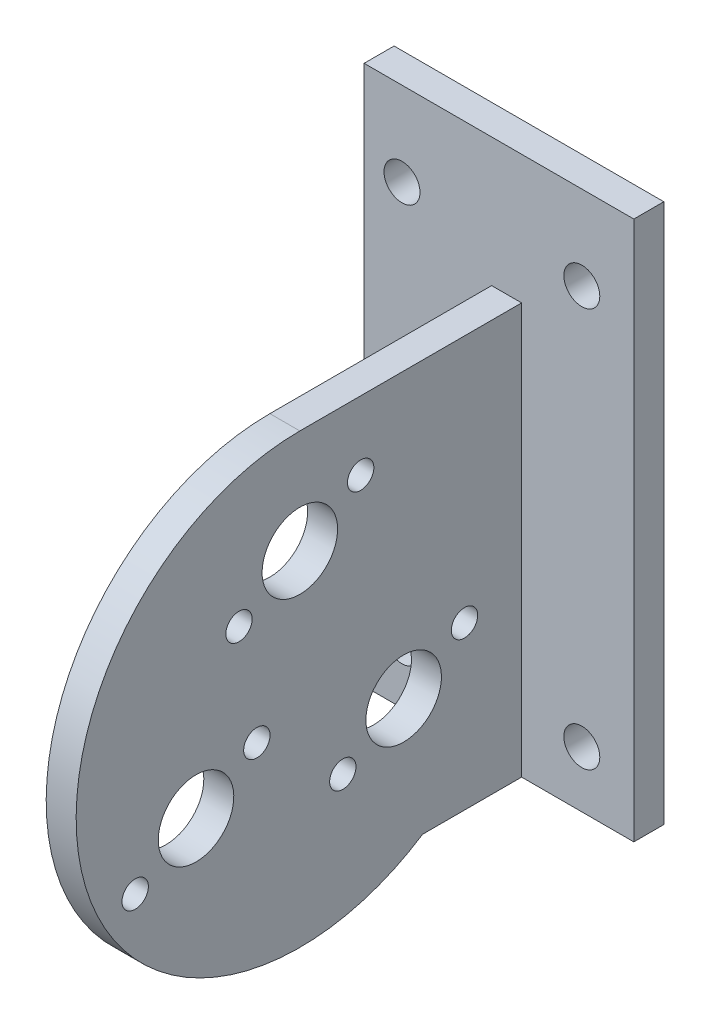
ISO-10303-21;
HEADER;
FILE_DESCRIPTION(('STEP AP214'),'2;1');
FILE_NAME('part.step','',(''),(''),'','','');
FILE_SCHEMA(('AUTOMOTIVE_DESIGN { 1 0 10303 214 1 1 1 1 }'));
ENDSEC;
DATA;
#1=APPLICATION_CONTEXT('core data for automotive mechanical design processes');
#2=APPLICATION_PROTOCOL_DEFINITION('international standard','automotive_design',2000,#1);
#3=PRODUCT_CONTEXT('',#1,'mechanical');
#4=PRODUCT('Part','Part','',(#3));
#5=PRODUCT_RELATED_PRODUCT_CATEGORY('part','',(#4));
#6=PRODUCT_DEFINITION_FORMATION('','',#4);
#7=PRODUCT_DEFINITION_CONTEXT('part definition',#1,'design');
#8=PRODUCT_DEFINITION('design','',#6,#7);
#9=PRODUCT_DEFINITION_SHAPE('','',#8);
#10=(LENGTH_UNIT() NAMED_UNIT(*) SI_UNIT(.MILLI.,.METRE.));
#11=(NAMED_UNIT(*) PLANE_ANGLE_UNIT() SI_UNIT($,.RADIAN.));
#12=(NAMED_UNIT(*) SI_UNIT($,.STERADIAN.) SOLID_ANGLE_UNIT());
#13=UNCERTAINTY_MEASURE_WITH_UNIT(LENGTH_MEASURE(1.E-05),#10,'distance_accuracy_value','');
#14=(GEOMETRIC_REPRESENTATION_CONTEXT(3) GLOBAL_UNCERTAINTY_ASSIGNED_CONTEXT((#13)) GLOBAL_UNIT_ASSIGNED_CONTEXT((#10,
#11,#12)) REPRESENTATION_CONTEXT('',''));
#15=CARTESIAN_POINT('',(0.,0.,0.));
#16=DIRECTION('',(0.,0.,1.));
#17=DIRECTION('',(1.,0.,0.));
#18=AXIS2_PLACEMENT_3D('',#15,#16,#17);
#19=CARTESIAN_POINT('',(265.322812887282,1.09054952266361,-22.2293772062087));
#20=DIRECTION('',(1.,0.,0.));
#21=DIRECTION('',(0.,1.,0.));
#22=AXIS2_PLACEMENT_3D('',#19,#20,#21);
#23=CYLINDRICAL_SURFACE('',#22,23.6982);
#24=DIRECTION('',(1.,0.,0.));
#25=VECTOR('',#24,1.);
#26=CARTESIAN_POINT('',(265.322812887282,24.7887495226637,-22.2293772062087));
#27=LINE('',#26,#25);
#28=CARTESIAN_POINT('',(265.322812887282,24.7887495226637,-22.2293772062087));
#29=VERTEX_POINT('',#28);
#30=CARTESIAN_POINT('',(268.497812887282,24.7887495226637,-22.2293772062087));
#31=VERTEX_POINT('',#30);
#32=EDGE_CURVE('E121',#29,#31,#27,.T.);
#33=ORIENTED_EDGE('',*,*,#32,.F.);
#34=CARTESIAN_POINT('',(265.322812887282,1.09054952266361,-22.2293772062087));
#35=DIRECTION('',(-1.,0.,0.));
#36=DIRECTION('',(0.,-1.,0.));
#37=AXIS2_PLACEMENT_3D('',#34,#35,#36);
#38=CIRCLE('',#37,23.6982);
#39=CARTESIAN_POINT('',(265.322812887282,-18.7214504773365,-35.2328128768305));
#40=VERTEX_POINT('',#39);
#41=EDGE_CURVE('E11',#40,#29,#38,.T.);
#42=ORIENTED_EDGE('',*,*,#41,.F.);
#43=DIRECTION('',(1.,0.,0.));
#44=VECTOR('',#43,1.);
#45=CARTESIAN_POINT('',(265.322812887282,-18.7214504773365,-35.2328128768305));
#46=LINE('',#45,#44);
#47=CARTESIAN_POINT('',(268.497812887282,-18.7214504773365,-35.2328128768305));
#48=VERTEX_POINT('',#47);
#49=EDGE_CURVE('E124',#40,#48,#46,.T.);
#50=ORIENTED_EDGE('',*,*,#49,.T.);
#51=CARTESIAN_POINT('',(268.497812887282,1.09054952266361,-22.2293772062087));
#52=DIRECTION('',(-1.,0.,0.));
#53=DIRECTION('',(0.,-1.,0.));
#54=AXIS2_PLACEMENT_3D('',#51,#52,#53);
#55=CIRCLE('',#54,23.6982);
#56=EDGE_CURVE('E38',#48,#31,#55,.T.);
#57=ORIENTED_EDGE('',*,*,#56,.T.);
#58=EDGE_LOOP('',(#33,#42,#50,#57));
#59=FACE_BOUND('',#58,.T.);
#60=ADVANCED_FACE('F35',(#59),#23,.T.);
#61=CARTESIAN_POINT('',(0.,0.,-45.7243772062088));
#62=DIRECTION('',(0.,0.,1.));
#63=DIRECTION('',(1.,0.,0.));
#64=AXIS2_PLACEMENT_3D('',#61,#62,#63);
#65=PLANE('',#64);
#66=CARTESIAN_POINT('',(255.82566690415,-12.7524504773365,-45.7243772062088));
#67=DIRECTION('',(0.,0.,1.));
#68=DIRECTION('',(1.,0.,0.));
#69=AXIS2_PLACEMENT_3D('',#66,#67,#68);
#70=CIRCLE('',#69,1.90499999999999);
#71=CARTESIAN_POINT('',(257.73066690415,-12.7524504773365,-45.7243772062088));
#72=VERTEX_POINT('',#71);
#73=EDGE_CURVE('E262',#72,#72,#70,.T.);
#74=ORIENTED_EDGE('',*,*,#73,.F.);
#75=EDGE_LOOP('',(#74));
#76=FACE_BOUND('',#75,.T.);
#77=CARTESIAN_POINT('',(255.82566690415,29.5385495226635,-45.7243772062088));
#78=DIRECTION('',(0.,0.,1.));
#79=DIRECTION('',(1.,0.,0.));
#80=AXIS2_PLACEMENT_3D('',#77,#78,#79);
#81=CIRCLE('',#80,1.90499999999999);
#82=CARTESIAN_POINT('',(257.73066690415,29.5385495226635,-45.7243772062088));
#83=VERTEX_POINT('',#82);
#84=EDGE_CURVE('E256',#83,#83,#81,.T.);
#85=ORIENTED_EDGE('',*,*,#84,.F.);
#86=EDGE_LOOP('',(#85));
#87=FACE_BOUND('',#86,.T.);
#88=CARTESIAN_POINT('',(274.87566690415,29.5385495226635,-45.7243772062088));
#89=DIRECTION('',(0.,0.,1.));
#90=DIRECTION('',(1.,0.,0.));
#91=AXIS2_PLACEMENT_3D('',#88,#89,#90);
#92=CIRCLE('',#91,1.90499999999999);
#93=CARTESIAN_POINT('',(276.78066690415,29.5385495226635,-45.7243772062088));
#94=VERTEX_POINT('',#93);
#95=EDGE_CURVE('E250',#94,#94,#92,.T.);
#96=ORIENTED_EDGE('',*,*,#95,.F.);
#97=EDGE_LOOP('',(#96));
#98=FACE_BOUND('',#97,.T.);
#99=CARTESIAN_POINT('',(274.87566690415,-12.7524504773365,-45.7243772062088));
#100=DIRECTION('',(0.,0.,1.));
#101=DIRECTION('',(1.,0.,0.));
#102=AXIS2_PLACEMENT_3D('',#99,#100,#101);
#103=CIRCLE('',#102,1.90499999999999);
#104=CARTESIAN_POINT('',(276.78066690415,-12.7524504773365,-45.7243772062088));
#105=VERTEX_POINT('',#104);
#106=EDGE_CURVE('E242',#105,#105,#103,.T.);
#107=ORIENTED_EDGE('',*,*,#106,.F.);
#108=EDGE_LOOP('',(#107));
#109=FACE_BOUND('',#108,.T.);
#110=DIRECTION('',(0.,1.,0.));
#111=VECTOR('',#110,1.);
#112=CARTESIAN_POINT('',(265.322812887282,1.09054952266361,-45.7243772062088));
#113=LINE('',#112,#111);
#114=CARTESIAN_POINT('',(265.322812887282,-18.7214504773365,-45.7243772062088));
#115=VERTEX_POINT('',#114);
#116=CARTESIAN_POINT('',(265.322812887282,24.7887495226637,-45.7243772062088));
#117=VERTEX_POINT('',#116);
#118=EDGE_CURVE('E49',#115,#117,#113,.T.);
#119=ORIENTED_EDGE('',*,*,#118,.T.);
#120=DIRECTION('',(1.,0.,0.));
#121=VECTOR('',#120,1.);
#122=CARTESIAN_POINT('',(265.322812887282,24.7887495226637,-45.7243772062088));
#123=LINE('',#122,#121);
#124=CARTESIAN_POINT('',(268.497812887282,24.7887495226637,-45.7243772062088));
#125=VERTEX_POINT('',#124);
#126=EDGE_CURVE('E102',#117,#125,#123,.T.);
#127=ORIENTED_EDGE('',*,*,#126,.T.);
#128=DIRECTION('',(0.,1.,0.));
#129=VECTOR('',#128,1.);
#130=CARTESIAN_POINT('',(268.497812887282,1.09054952266361,-45.7243772062088));
#131=LINE('',#130,#129);
#132=CARTESIAN_POINT('',(268.497812887282,-18.7214504773365,-45.7243772062088));
#133=VERTEX_POINT('',#132);
#134=EDGE_CURVE('E57',#133,#125,#131,.T.);
#135=ORIENTED_EDGE('',*,*,#134,.F.);
#136=DIRECTION('',(1.,0.,0.));
#137=VECTOR('',#136,1.);
#138=CARTESIAN_POINT('',(280.387812887282,-18.7214504773365,-45.7243772062088));
#139=LINE('',#138,#137);
#140=CARTESIAN_POINT('',(280.387812887282,-18.7214504773365,-45.7243772062088));
#141=VERTEX_POINT('',#140);
#142=EDGE_CURVE('E100',#133,#141,#139,.T.);
#143=ORIENTED_EDGE('',*,*,#142,.T.);
#144=DIRECTION('',(0.,1.,0.));
#145=VECTOR('',#144,1.);
#146=CARTESIAN_POINT('',(280.387812887282,-18.7214504773365,-45.7243772062088));
#147=LINE('',#146,#145);
#148=CARTESIAN_POINT('',(280.387812887282,38.4285495226635,-45.7243772062088));
#149=VERTEX_POINT('',#148);
#150=EDGE_CURVE('E132',#141,#149,#147,.T.);
#151=ORIENTED_EDGE('',*,*,#150,.T.);
#152=DIRECTION('',(-1.,0.,0.));
#153=VECTOR('',#152,1.);
#154=CARTESIAN_POINT('',(280.387812887282,38.4285495226635,-45.7243772062088));
#155=LINE('',#154,#153);
#156=CARTESIAN_POINT('',(251.812812887282,38.4285495226635,-45.7243772062088));
#157=VERTEX_POINT('',#156);
#158=EDGE_CURVE('E134',#149,#157,#155,.T.);
#159=ORIENTED_EDGE('',*,*,#158,.T.);
#160=DIRECTION('',(0.,-1.,0.));
#161=VECTOR('',#160,1.);
#162=CARTESIAN_POINT('',(251.812812887282,-18.7214504773365,-45.7243772062088));
#163=LINE('',#162,#161);
#164=CARTESIAN_POINT('',(251.812812887282,-18.7214504773365,-45.7243772062088));
#165=VERTEX_POINT('',#164);
#166=EDGE_CURVE('E115',#157,#165,#163,.T.);
#167=ORIENTED_EDGE('',*,*,#166,.T.);
#168=EDGE_CURVE('E114',#165,#115,#139,.T.);
#169=ORIENTED_EDGE('',*,*,#168,.T.);
#170=EDGE_LOOP('',(#119,#127,#135,#143,#151,#159,#167,#169));
#171=FACE_BOUND('',#170,.T.);
#172=ADVANCED_FACE('F98',(#76,#87,#98,#109,#171),#65,.T.);
#173=CARTESIAN_POINT('',(265.322812887282,1.09054952266361,-22.2293772062087));
#174=DIRECTION('',(-1.,0.,0.));
#175=DIRECTION('',(0.,-1.,0.));
#176=AXIS2_PLACEMENT_3D('',#173,#174,#175);
#177=PLANE('',#176);
#178=ORIENTED_EDGE('',*,*,#118,.F.);
#179=DIRECTION('',(0.,0.,1.));
#180=VECTOR('',#179,1.);
#181=CARTESIAN_POINT('',(265.322812887282,-18.7214504773365,0.));
#182=LINE('',#181,#180);
#183=EDGE_CURVE('E120',#115,#40,#182,.T.);
#184=ORIENTED_EDGE('',*,*,#183,.T.);
#185=ORIENTED_EDGE('',*,*,#41,.T.);
#186=DIRECTION('',(0.,0.,1.));
#187=VECTOR('',#186,1.);
#188=CARTESIAN_POINT('',(265.322812887282,24.7887495226636,0.));
#189=LINE('',#188,#187);
#190=EDGE_CURVE('E237',#117,#29,#189,.T.);
#191=ORIENTED_EDGE('',*,*,#190,.F.);
#192=EDGE_LOOP('',(#178,#184,#185,#191));
#193=FACE_BOUND('',#192,.T.);
#194=CARTESIAN_POINT('',(265.322812887282,-5.25945047733652,-33.2278998342711));
#195=DIRECTION('',(-1.,0.,0.));
#196=DIRECTION('',(0.,-1.,0.));
#197=AXIS2_PLACEMENT_3D('',#194,#195,#196);
#198=CIRCLE('',#197,4.0005);
#199=CARTESIAN_POINT('',(265.322812887282,-9.25995047733652,-33.2278998342711));
#200=VERTEX_POINT('',#199);
#201=EDGE_CURVE('E162',#200,#200,#198,.T.);
#202=ORIENTED_EDGE('',*,*,#201,.F.);
#203=EDGE_LOOP('',(#202));
#204=FACE_BOUND('',#203,.T.);
#205=CARTESIAN_POINT('',(265.322812887282,10.0694495226637,-15.7842429461641));
#206=DIRECTION('',(-1.,0.,0.));
#207=DIRECTION('',(0.,-1.,0.));
#208=AXIS2_PLACEMENT_3D('',#205,#206,#207);
#209=CIRCLE('',#208,1.397);
#210=CARTESIAN_POINT('',(265.322812887282,8.67244952266366,-15.7842429461641));
#211=VERTEX_POINT('',#210);
#212=EDGE_CURVE('E174',#211,#211,#209,.T.);
#213=ORIENTED_EDGE('',*,*,#212,.F.);
#214=EDGE_LOOP('',(#213));
#215=FACE_BOUND('',#214,.T.);
#216=CARTESIAN_POINT('',(265.322812887282,-1.53835047733667,-39.6730340943157));
#217=DIRECTION('',(-1.,0.,0.));
#218=DIRECTION('',(0.,-1.,0.));
#219=AXIS2_PLACEMENT_3D('',#216,#217,#218);
#220=CIRCLE('',#219,1.39700000000001);
#221=CARTESIAN_POINT('',(265.322812887282,-2.93535047733668,-39.6730340943157));
#222=VERTEX_POINT('',#221);
#223=EDGE_CURVE('E186',#222,#222,#220,.T.);
#224=ORIENTED_EDGE('',*,*,#223,.F.);
#225=EDGE_LOOP('',(#224));
#226=FACE_BOUND('',#225,.T.);
#227=CARTESIAN_POINT('',(265.322812887282,-1.53835047733652,-17.6759888381909));
#228=DIRECTION('',(-1.,0.,0.));
#229=DIRECTION('',(0.,-1.,0.));
#230=AXIS2_PLACEMENT_3D('',#227,#228,#229);
#231=CIRCLE('',#230,1.397);
#232=CARTESIAN_POINT('',(265.322812887282,-2.93535047733652,-17.6759888381909));
#233=VERTEX_POINT('',#232);
#234=EDGE_CURVE('E198',#233,#233,#231,.T.);
#235=ORIENTED_EDGE('',*,*,#234,.F.);
#236=EDGE_LOOP('',(#235));
#237=FACE_BOUND('',#236,.T.);
#238=CARTESIAN_POINT('',(265.322812887282,-8.98055047733622,-4.78572031810167));
#239=DIRECTION('',(-1.,0.,0.));
#240=DIRECTION('',(0.,-1.,0.));
#241=AXIS2_PLACEMENT_3D('',#238,#239,#240);
#242=CIRCLE('',#241,1.397);
#243=CARTESIAN_POINT('',(265.322812887282,-10.3775504773362,-4.78572031810167));
#244=VERTEX_POINT('',#243);
#245=EDGE_CURVE('E204',#244,#244,#242,.T.);
#246=ORIENTED_EDGE('',*,*,#245,.F.);
#247=EDGE_LOOP('',(#246));
#248=FACE_BOUND('',#247,.T.);
#249=CARTESIAN_POINT('',(265.322812887282,-8.98055047733638,-26.7827655742264));
#250=DIRECTION('',(-1.,0.,0.));
#251=DIRECTION('',(0.,-1.,0.));
#252=AXIS2_PLACEMENT_3D('',#249,#250,#251);
#253=CIRCLE('',#252,1.397);
#254=CARTESIAN_POINT('',(265.322812887282,-10.3775504773364,-26.7827655742264));
#255=VERTEX_POINT('',#254);
#256=EDGE_CURVE('E192',#255,#255,#253,.T.);
#257=ORIENTED_EDGE('',*,*,#256,.F.);
#258=EDGE_LOOP('',(#257));
#259=FACE_BOUND('',#258,.T.);
#260=CARTESIAN_POINT('',(265.322812887282,17.5116495226634,-28.6745114662534));
#261=DIRECTION('',(-1.,0.,0.));
#262=DIRECTION('',(0.,-1.,0.));
#263=AXIS2_PLACEMENT_3D('',#260,#261,#262);
#264=CIRCLE('',#263,1.397);
#265=CARTESIAN_POINT('',(265.322812887282,16.1146495226634,-28.6745114662534));
#266=VERTEX_POINT('',#265);
#267=EDGE_CURVE('E180',#266,#266,#264,.T.);
#268=ORIENTED_EDGE('',*,*,#267,.F.);
#269=EDGE_LOOP('',(#268));
#270=FACE_BOUND('',#269,.T.);
#271=CARTESIAN_POINT('',(265.322812887282,-5.25945047733637,-11.2308545781463));
#272=DIRECTION('',(-1.,0.,0.));
#273=DIRECTION('',(0.,-1.,0.));
#274=AXIS2_PLACEMENT_3D('',#271,#272,#273);
#275=CIRCLE('',#274,4.0005);
#276=CARTESIAN_POINT('',(265.322812887282,-9.25995047733636,-11.2308545781463));
#277=VERTEX_POINT('',#276);
#278=EDGE_CURVE('E168',#277,#277,#275,.T.);
#279=ORIENTED_EDGE('',*,*,#278,.F.);
#280=EDGE_LOOP('',(#279));
#281=FACE_BOUND('',#280,.T.);
#282=CARTESIAN_POINT('',(265.322812887282,13.7905495226637,-22.2293772062087));
#283=DIRECTION('',(-1.,0.,0.));
#284=DIRECTION('',(0.,-1.,0.));
#285=AXIS2_PLACEMENT_3D('',#282,#283,#284);
#286=CIRCLE('',#285,4.0005);
#287=CARTESIAN_POINT('',(265.322812887282,9.79004952266365,-22.2293772062087));
#288=VERTEX_POINT('',#287);
#289=EDGE_CURVE('E156',#288,#288,#286,.T.);
#290=ORIENTED_EDGE('',*,*,#289,.F.);
#291=EDGE_LOOP('',(#290));
#292=FACE_BOUND('',#291,.T.);
#293=ADVANCED_FACE('F223',(#193,#204,#215,#226,#237,#248,#259,#270,#281,#292),#177,.T.);
#294=CARTESIAN_POINT('',(268.497812887282,1.09054952266361,-22.2293772062087));
#295=DIRECTION('',(-1.,0.,0.));
#296=DIRECTION('',(0.,-1.,0.));
#297=AXIS2_PLACEMENT_3D('',#294,#295,#296);
#298=PLANE('',#297);
#299=ORIENTED_EDGE('',*,*,#56,.F.);
#300=DIRECTION('',(0.,0.,1.));
#301=VECTOR('',#300,1.);
#302=CARTESIAN_POINT('',(268.497812887282,-18.7214504773365,0.));
#303=LINE('',#302,#301);
#304=EDGE_CURVE('E110',#133,#48,#303,.T.);
#305=ORIENTED_EDGE('',*,*,#304,.F.);
#306=ORIENTED_EDGE('',*,*,#134,.T.);
#307=DIRECTION('',(0.,0.,1.));
#308=VECTOR('',#307,1.);
#309=CARTESIAN_POINT('',(268.497812887282,24.7887495226636,0.));
#310=LINE('',#309,#308);
#311=EDGE_CURVE('E240',#125,#31,#310,.T.);
#312=ORIENTED_EDGE('',*,*,#311,.T.);
#313=EDGE_LOOP('',(#299,#305,#306,#312));
#314=FACE_BOUND('',#313,.T.);
#315=CARTESIAN_POINT('',(268.497812887282,-8.98055047733622,-4.78572031810167));
#316=DIRECTION('',(-1.,0.,0.));
#317=DIRECTION('',(0.,-1.,0.));
#318=AXIS2_PLACEMENT_3D('',#315,#316,#317);
#319=CIRCLE('',#318,1.397);
#320=CARTESIAN_POINT('',(268.497812887282,-10.3775504773362,-4.78572031810167));
#321=VERTEX_POINT('',#320);
#322=EDGE_CURVE('E201',#321,#321,#319,.T.);
#323=ORIENTED_EDGE('',*,*,#322,.T.);
#324=EDGE_LOOP('',(#323));
#325=FACE_BOUND('',#324,.T.);
#326=CARTESIAN_POINT('',(268.497812887282,-1.53835047733652,-17.6759888381909));
#327=DIRECTION('',(-1.,0.,0.));
#328=DIRECTION('',(0.,-1.,0.));
#329=AXIS2_PLACEMENT_3D('',#326,#327,#328);
#330=CIRCLE('',#329,1.397);
#331=CARTESIAN_POINT('',(268.497812887282,-2.93535047733652,-17.6759888381909));
#332=VERTEX_POINT('',#331);
#333=EDGE_CURVE('E195',#332,#332,#330,.T.);
#334=ORIENTED_EDGE('',*,*,#333,.T.);
#335=EDGE_LOOP('',(#334));
#336=FACE_BOUND('',#335,.T.);
#337=CARTESIAN_POINT('',(268.497812887282,-8.98055047733638,-26.7827655742264));
#338=DIRECTION('',(-1.,0.,0.));
#339=DIRECTION('',(0.,-1.,0.));
#340=AXIS2_PLACEMENT_3D('',#337,#338,#339);
#341=CIRCLE('',#340,1.397);
#342=CARTESIAN_POINT('',(268.497812887282,-10.3775504773364,-26.7827655742264));
#343=VERTEX_POINT('',#342);
#344=EDGE_CURVE('E189',#343,#343,#341,.T.);
#345=ORIENTED_EDGE('',*,*,#344,.T.);
#346=EDGE_LOOP('',(#345));
#347=FACE_BOUND('',#346,.T.);
#348=CARTESIAN_POINT('',(268.497812887282,-1.53835047733667,-39.6730340943157));
#349=DIRECTION('',(-1.,0.,0.));
#350=DIRECTION('',(0.,-1.,0.));
#351=AXIS2_PLACEMENT_3D('',#348,#349,#350);
#352=CIRCLE('',#351,1.39700000000001);
#353=CARTESIAN_POINT('',(268.497812887282,-2.93535047733668,-39.6730340943157));
#354=VERTEX_POINT('',#353);
#355=EDGE_CURVE('E183',#354,#354,#352,.T.);
#356=ORIENTED_EDGE('',*,*,#355,.T.);
#357=EDGE_LOOP('',(#356));
#358=FACE_BOUND('',#357,.T.);
#359=CARTESIAN_POINT('',(268.497812887282,17.5116495226634,-28.6745114662534));
#360=DIRECTION('',(-1.,0.,0.));
#361=DIRECTION('',(0.,-1.,0.));
#362=AXIS2_PLACEMENT_3D('',#359,#360,#361);
#363=CIRCLE('',#362,1.397);
#364=CARTESIAN_POINT('',(268.497812887282,16.1146495226634,-28.6745114662534));
#365=VERTEX_POINT('',#364);
#366=EDGE_CURVE('E177',#365,#365,#363,.T.);
#367=ORIENTED_EDGE('',*,*,#366,.T.);
#368=EDGE_LOOP('',(#367));
#369=FACE_BOUND('',#368,.T.);
#370=CARTESIAN_POINT('',(268.497812887282,10.0694495226637,-15.7842429461641));
#371=DIRECTION('',(-1.,0.,0.));
#372=DIRECTION('',(0.,-1.,0.));
#373=AXIS2_PLACEMENT_3D('',#370,#371,#372);
#374=CIRCLE('',#373,1.397);
#375=CARTESIAN_POINT('',(268.497812887282,8.67244952266366,-15.7842429461641));
#376=VERTEX_POINT('',#375);
#377=EDGE_CURVE('E171',#376,#376,#374,.T.);
#378=ORIENTED_EDGE('',*,*,#377,.T.);
#379=EDGE_LOOP('',(#378));
#380=FACE_BOUND('',#379,.T.);
#381=CARTESIAN_POINT('',(268.497812887282,-5.25945047733637,-11.2308545781463));
#382=DIRECTION('',(-1.,0.,0.));
#383=DIRECTION('',(0.,-1.,0.));
#384=AXIS2_PLACEMENT_3D('',#381,#382,#383);
#385=CIRCLE('',#384,4.0005);
#386=CARTESIAN_POINT('',(268.497812887282,-9.25995047733636,-11.2308545781463));
#387=VERTEX_POINT('',#386);
#388=EDGE_CURVE('E165',#387,#387,#385,.T.);
#389=ORIENTED_EDGE('',*,*,#388,.T.);
#390=EDGE_LOOP('',(#389));
#391=FACE_BOUND('',#390,.T.);
#392=CARTESIAN_POINT('',(268.497812887282,-5.25945047733652,-33.2278998342711));
#393=DIRECTION('',(-1.,0.,0.));
#394=DIRECTION('',(0.,-1.,0.));
#395=AXIS2_PLACEMENT_3D('',#392,#393,#394);
#396=CIRCLE('',#395,4.0005);
#397=CARTESIAN_POINT('',(268.497812887282,-9.25995047733652,-33.2278998342711));
#398=VERTEX_POINT('',#397);
#399=EDGE_CURVE('E159',#398,#398,#396,.T.);
#400=ORIENTED_EDGE('',*,*,#399,.T.);
#401=EDGE_LOOP('',(#400));
#402=FACE_BOUND('',#401,.T.);
#403=CARTESIAN_POINT('',(268.497812887282,13.7905495226637,-22.2293772062087));
#404=DIRECTION('',(-1.,0.,0.));
#405=DIRECTION('',(0.,-1.,0.));
#406=AXIS2_PLACEMENT_3D('',#403,#404,#405);
#407=CIRCLE('',#406,4.0005);
#408=CARTESIAN_POINT('',(268.497812887282,9.79004952266365,-22.2293772062087));
#409=VERTEX_POINT('',#408);
#410=EDGE_CURVE('E155',#409,#409,#407,.T.);
#411=ORIENTED_EDGE('',*,*,#410,.T.);
#412=EDGE_LOOP('',(#411));
#413=FACE_BOUND('',#412,.T.);
#414=ADVANCED_FACE('F118',(#314,#325,#336,#347,#358,#369,#380,#391,#402,#413),#298,.F.);
#415=CARTESIAN_POINT('',(265.322812887282,-8.98055047733622,-4.78572031810167));
#416=DIRECTION('',(1.,0.,0.));
#417=DIRECTION('',(0.,1.,0.));
#418=AXIS2_PLACEMENT_3D('',#415,#416,#417);
#419=CYLINDRICAL_SURFACE('',#418,1.397);
#420=ORIENTED_EDGE('',*,*,#245,.T.);
#421=EDGE_LOOP('',(#420));
#422=FACE_BOUND('',#421,.T.);
#423=ORIENTED_EDGE('',*,*,#322,.F.);
#424=EDGE_LOOP('',(#423));
#425=FACE_BOUND('',#424,.T.);
#426=ADVANCED_FACE('F211',(#422,#425),#419,.F.);
#427=CARTESIAN_POINT('',(265.322812887282,-1.53835047733652,-17.6759888381909));
#428=DIRECTION('',(1.,0.,0.));
#429=DIRECTION('',(0.,1.,0.));
#430=AXIS2_PLACEMENT_3D('',#427,#428,#429);
#431=CYLINDRICAL_SURFACE('',#430,1.397);
#432=ORIENTED_EDGE('',*,*,#234,.T.);
#433=EDGE_LOOP('',(#432));
#434=FACE_BOUND('',#433,.T.);
#435=ORIENTED_EDGE('',*,*,#333,.F.);
#436=EDGE_LOOP('',(#435));
#437=FACE_BOUND('',#436,.T.);
#438=ADVANCED_FACE('F213',(#434,#437),#431,.F.);
#439=CARTESIAN_POINT('',(265.322812887282,-8.98055047733638,-26.7827655742264));
#440=DIRECTION('',(1.,0.,0.));
#441=DIRECTION('',(0.,1.,0.));
#442=AXIS2_PLACEMENT_3D('',#439,#440,#441);
#443=CYLINDRICAL_SURFACE('',#442,1.397);
#444=ORIENTED_EDGE('',*,*,#256,.T.);
#445=EDGE_LOOP('',(#444));
#446=FACE_BOUND('',#445,.T.);
#447=ORIENTED_EDGE('',*,*,#344,.F.);
#448=EDGE_LOOP('',(#447));
#449=FACE_BOUND('',#448,.T.);
#450=ADVANCED_FACE('F220',(#446,#449),#443,.F.);
#451=CARTESIAN_POINT('',(265.322812887282,-1.53835047733667,-39.6730340943157));
#452=DIRECTION('',(1.,0.,0.));
#453=DIRECTION('',(0.,1.,0.));
#454=AXIS2_PLACEMENT_3D('',#451,#452,#453);
#455=CYLINDRICAL_SURFACE('',#454,1.39700000000001);
#456=ORIENTED_EDGE('',*,*,#223,.T.);
#457=EDGE_LOOP('',(#456));
#458=FACE_BOUND('',#457,.T.);
#459=ORIENTED_EDGE('',*,*,#355,.F.);
#460=EDGE_LOOP('',(#459));
#461=FACE_BOUND('',#460,.T.);
#462=ADVANCED_FACE('F325',(#458,#461),#455,.F.);
#463=CARTESIAN_POINT('',(265.322812887282,17.5116495226634,-28.6745114662534));
#464=DIRECTION('',(1.,0.,0.));
#465=DIRECTION('',(0.,1.,0.));
#466=AXIS2_PLACEMENT_3D('',#463,#464,#465);
#467=CYLINDRICAL_SURFACE('',#466,1.397);
#468=ORIENTED_EDGE('',*,*,#267,.T.);
#469=EDGE_LOOP('',(#468));
#470=FACE_BOUND('',#469,.T.);
#471=ORIENTED_EDGE('',*,*,#366,.F.);
#472=EDGE_LOOP('',(#471));
#473=FACE_BOUND('',#472,.T.);
#474=ADVANCED_FACE('F321',(#470,#473),#467,.F.);
#475=CARTESIAN_POINT('',(265.322812887282,10.0694495226637,-15.7842429461641));
#476=DIRECTION('',(1.,0.,0.));
#477=DIRECTION('',(0.,1.,0.));
#478=AXIS2_PLACEMENT_3D('',#475,#476,#477);
#479=CYLINDRICAL_SURFACE('',#478,1.397);
#480=ORIENTED_EDGE('',*,*,#212,.T.);
#481=EDGE_LOOP('',(#480));
#482=FACE_BOUND('',#481,.T.);
#483=ORIENTED_EDGE('',*,*,#377,.F.);
#484=EDGE_LOOP('',(#483));
#485=FACE_BOUND('',#484,.T.);
#486=ADVANCED_FACE('F317',(#482,#485),#479,.F.);
#487=CARTESIAN_POINT('',(265.322812887282,-5.25945047733637,-11.2308545781463));
#488=DIRECTION('',(1.,0.,0.));
#489=DIRECTION('',(0.,1.,0.));
#490=AXIS2_PLACEMENT_3D('',#487,#488,#489);
#491=CYLINDRICAL_SURFACE('',#490,4.0005);
#492=ORIENTED_EDGE('',*,*,#278,.T.);
#493=EDGE_LOOP('',(#492));
#494=FACE_BOUND('',#493,.T.);
#495=ORIENTED_EDGE('',*,*,#388,.F.);
#496=EDGE_LOOP('',(#495));
#497=FACE_BOUND('',#496,.T.);
#498=ADVANCED_FACE('F313',(#494,#497),#491,.F.);
#499=CARTESIAN_POINT('',(265.322812887282,-5.25945047733652,-33.2278998342711));
#500=DIRECTION('',(1.,0.,0.));
#501=DIRECTION('',(0.,1.,0.));
#502=AXIS2_PLACEMENT_3D('',#499,#500,#501);
#503=CYLINDRICAL_SURFACE('',#502,4.0005);
#504=ORIENTED_EDGE('',*,*,#201,.T.);
#505=EDGE_LOOP('',(#504));
#506=FACE_BOUND('',#505,.T.);
#507=ORIENTED_EDGE('',*,*,#399,.F.);
#508=EDGE_LOOP('',(#507));
#509=FACE_BOUND('',#508,.T.);
#510=ADVANCED_FACE('F309',(#506,#509),#503,.F.);
#511=CARTESIAN_POINT('',(265.322812887282,13.7905495226637,-22.2293772062087));
#512=DIRECTION('',(1.,0.,0.));
#513=DIRECTION('',(0.,1.,0.));
#514=AXIS2_PLACEMENT_3D('',#511,#512,#513);
#515=CYLINDRICAL_SURFACE('',#514,4.0005);
#516=ORIENTED_EDGE('',*,*,#289,.T.);
#517=EDGE_LOOP('',(#516));
#518=FACE_BOUND('',#517,.T.);
#519=ORIENTED_EDGE('',*,*,#410,.F.);
#520=EDGE_LOOP('',(#519));
#521=FACE_BOUND('',#520,.T.);
#522=ADVANCED_FACE('F306',(#518,#521),#515,.F.);
#523=CARTESIAN_POINT('',(280.387812887282,-18.7214504773365,-45.7243772062088));
#524=DIRECTION('',(-1.,0.,0.));
#525=DIRECTION('',(0.,0.,1.));
#526=AXIS2_PLACEMENT_3D('',#523,#524,#525);
#527=PLANE('',#526);
#528=DIRECTION('',(0.,1.,0.));
#529=VECTOR('',#528,1.);
#530=CARTESIAN_POINT('',(280.387812887282,-18.7214504773365,-48.8993772062088));
#531=LINE('',#530,#529);
#532=CARTESIAN_POINT('',(280.387812887282,-18.7214504773365,-48.8993772062088));
#533=VERTEX_POINT('',#532);
#534=CARTESIAN_POINT('',(280.387812887282,38.4285495226635,-48.8993772062088));
#535=VERTEX_POINT('',#534);
#536=EDGE_CURVE('E131',#533,#535,#531,.T.);
#537=ORIENTED_EDGE('',*,*,#536,.T.);
#538=DIRECTION('',(0.,0.,-1.));
#539=VECTOR('',#538,1.);
#540=CARTESIAN_POINT('',(280.387812887282,38.4285495226635,-45.7243772062088));
#541=LINE('',#540,#539);
#542=EDGE_CURVE('E104',#149,#535,#541,.T.);
#543=ORIENTED_EDGE('',*,*,#542,.F.);
#544=ORIENTED_EDGE('',*,*,#150,.F.);
#545=DIRECTION('',(0.,0.,-1.));
#546=VECTOR('',#545,1.);
#547=CARTESIAN_POINT('',(280.387812887282,-18.7214504773365,-45.7243772062088));
#548=LINE('',#547,#546);
#549=EDGE_CURVE('E112',#141,#533,#548,.T.);
#550=ORIENTED_EDGE('',*,*,#549,.T.);
#551=EDGE_LOOP('',(#537,#543,#544,#550));
#552=FACE_BOUND('',#551,.T.);
#553=ADVANCED_FACE('F286',(#552),#527,.F.);
#554=CARTESIAN_POINT('',(280.387812887282,38.4285495226635,-45.7243772062088));
#555=DIRECTION('',(0.,-1.,0.));
#556=DIRECTION('',(0.,0.,-1.));
#557=AXIS2_PLACEMENT_3D('',#554,#555,#556);
#558=PLANE('',#557);
#559=DIRECTION('',(-1.,0.,0.));
#560=VECTOR('',#559,1.);
#561=CARTESIAN_POINT('',(280.387812887282,38.4285495226635,-48.8993772062088));
#562=LINE('',#561,#560);
#563=CARTESIAN_POINT('',(251.812812887282,38.4285495226635,-48.8993772062088));
#564=VERTEX_POINT('',#563);
#565=EDGE_CURVE('E140',#535,#564,#562,.T.);
#566=ORIENTED_EDGE('',*,*,#565,.T.);
#567=DIRECTION('',(0.,0.,-1.));
#568=VECTOR('',#567,1.);
#569=CARTESIAN_POINT('',(251.812812887282,38.4285495226635,-45.7243772062088));
#570=LINE('',#569,#568);
#571=EDGE_CURVE('E149',#157,#564,#570,.T.);
#572=ORIENTED_EDGE('',*,*,#571,.F.);
#573=ORIENTED_EDGE('',*,*,#158,.F.);
#574=ORIENTED_EDGE('',*,*,#542,.T.);
#575=EDGE_LOOP('',(#566,#572,#573,#574));
#576=FACE_BOUND('',#575,.T.);
#577=ADVANCED_FACE('F291',(#576),#558,.F.);
#578=CARTESIAN_POINT('',(251.812812887282,-18.7214504773365,-45.7243772062088));
#579=DIRECTION('',(1.,0.,0.));
#580=DIRECTION('',(0.,0.,-1.));
#581=AXIS2_PLACEMENT_3D('',#578,#579,#580);
#582=PLANE('',#581);
#583=DIRECTION('',(0.,-1.,0.));
#584=VECTOR('',#583,1.);
#585=CARTESIAN_POINT('',(251.812812887282,-18.7214504773365,-48.8993772062088));
#586=LINE('',#585,#584);
#587=CARTESIAN_POINT('',(251.812812887282,-18.7214504773365,-48.8993772062088));
#588=VERTEX_POINT('',#587);
#589=EDGE_CURVE('E142',#564,#588,#586,.T.);
#590=ORIENTED_EDGE('',*,*,#589,.T.);
#591=DIRECTION('',(0.,0.,-1.));
#592=VECTOR('',#591,1.);
#593=CARTESIAN_POINT('',(251.812812887282,-18.7214504773365,-45.7243772062088));
#594=LINE('',#593,#592);
#595=EDGE_CURVE('E146',#165,#588,#594,.T.);
#596=ORIENTED_EDGE('',*,*,#595,.F.);
#597=ORIENTED_EDGE('',*,*,#166,.F.);
#598=ORIENTED_EDGE('',*,*,#571,.T.);
#599=EDGE_LOOP('',(#590,#596,#597,#598));
#600=FACE_BOUND('',#599,.T.);
#601=ADVANCED_FACE('F293',(#600),#582,.F.);
#602=CARTESIAN_POINT('',(280.387812887282,-18.7214504773365,-45.7243772062088));
#603=DIRECTION('',(0.,1.,0.));
#604=DIRECTION('',(-1.,0.,0.));
#605=AXIS2_PLACEMENT_3D('',#602,#603,#604);
#606=PLANE('',#605);
#607=DIRECTION('',(1.,0.,0.));
#608=VECTOR('',#607,1.);
#609=CARTESIAN_POINT('',(280.387812887282,-18.7214504773365,-48.8993772062088));
#610=LINE('',#609,#608);
#611=EDGE_CURVE('E135',#588,#533,#610,.T.);
#612=ORIENTED_EDGE('',*,*,#611,.T.);
#613=ORIENTED_EDGE('',*,*,#549,.F.);
#614=ORIENTED_EDGE('',*,*,#142,.F.);
#615=ORIENTED_EDGE('',*,*,#304,.T.);
#616=ORIENTED_EDGE('',*,*,#49,.F.);
#617=ORIENTED_EDGE('',*,*,#183,.F.);
#618=ORIENTED_EDGE('',*,*,#168,.F.);
#619=ORIENTED_EDGE('',*,*,#595,.T.);
#620=EDGE_LOOP('',(#612,#613,#614,#615,#616,#617,#618,#619));
#621=FACE_BOUND('',#620,.T.);
#622=ADVANCED_FACE('F108',(#621),#606,.F.);
#623=CARTESIAN_POINT('',(0.,0.,-48.8993772062088));
#624=DIRECTION('',(0.,0.,1.));
#625=DIRECTION('',(1.,0.,0.));
#626=AXIS2_PLACEMENT_3D('',#623,#624,#625);
#627=PLANE('',#626);
#628=CARTESIAN_POINT('',(255.82566690415,-12.7524504773365,-48.8993772062088));
#629=DIRECTION('',(0.,0.,-1.));
#630=DIRECTION('',(-1.,0.,0.));
#631=AXIS2_PLACEMENT_3D('',#628,#629,#630);
#632=CIRCLE('',#631,1.90499999999999);
#633=CARTESIAN_POINT('',(253.92066690415,-12.7524504773365,-48.8993772062088));
#634=VERTEX_POINT('',#633);
#635=EDGE_CURVE('E265',#634,#634,#632,.T.);
#636=ORIENTED_EDGE('',*,*,#635,.F.);
#637=EDGE_LOOP('',(#636));
#638=FACE_BOUND('',#637,.T.);
#639=CARTESIAN_POINT('',(255.82566690415,29.5385495226635,-48.8993772062088));
#640=DIRECTION('',(0.,0.,-1.));
#641=DIRECTION('',(-1.,0.,0.));
#642=AXIS2_PLACEMENT_3D('',#639,#640,#641);
#643=CIRCLE('',#642,1.90499999999999);
#644=CARTESIAN_POINT('',(253.92066690415,29.5385495226635,-48.8993772062088));
#645=VERTEX_POINT('',#644);
#646=EDGE_CURVE('E259',#645,#645,#643,.T.);
#647=ORIENTED_EDGE('',*,*,#646,.F.);
#648=EDGE_LOOP('',(#647));
#649=FACE_BOUND('',#648,.T.);
#650=CARTESIAN_POINT('',(274.87566690415,29.5385495226635,-48.8993772062088));
#651=DIRECTION('',(0.,0.,-1.));
#652=DIRECTION('',(-1.,0.,0.));
#653=AXIS2_PLACEMENT_3D('',#650,#651,#652);
#654=CIRCLE('',#653,1.90499999999999);
#655=CARTESIAN_POINT('',(272.97066690415,29.5385495226635,-48.8993772062088));
#656=VERTEX_POINT('',#655);
#657=EDGE_CURVE('E253',#656,#656,#654,.T.);
#658=ORIENTED_EDGE('',*,*,#657,.F.);
#659=EDGE_LOOP('',(#658));
#660=FACE_BOUND('',#659,.T.);
#661=CARTESIAN_POINT('',(274.87566690415,-12.7524504773365,-48.8993772062088));
#662=DIRECTION('',(0.,0.,-1.));
#663=DIRECTION('',(-1.,0.,0.));
#664=AXIS2_PLACEMENT_3D('',#661,#662,#663);
#665=CIRCLE('',#664,1.90499999999999);
#666=CARTESIAN_POINT('',(272.97066690415,-12.7524504773365,-48.8993772062088));
#667=VERTEX_POINT('',#666);
#668=EDGE_CURVE('E247',#667,#667,#665,.T.);
#669=ORIENTED_EDGE('',*,*,#668,.F.);
#670=EDGE_LOOP('',(#669));
#671=FACE_BOUND('',#670,.T.);
#672=ORIENTED_EDGE('',*,*,#536,.F.);
#673=ORIENTED_EDGE('',*,*,#611,.F.);
#674=ORIENTED_EDGE('',*,*,#589,.F.);
#675=ORIENTED_EDGE('',*,*,#565,.F.);
#676=EDGE_LOOP('',(#672,#673,#674,#675));
#677=FACE_BOUND('',#676,.T.);
#678=ADVANCED_FACE('F271',(#638,#649,#660,#671,#677),#627,.F.);
#679=CARTESIAN_POINT('',(265.322812887282,24.7887495226636,0.));
#680=DIRECTION('',(0.,1.,0.));
#681=DIRECTION('',(-1.,0.,0.));
#682=AXIS2_PLACEMENT_3D('',#679,#680,#681);
#683=PLANE('',#682);
#684=ORIENTED_EDGE('',*,*,#311,.F.);
#685=ORIENTED_EDGE('',*,*,#126,.F.);
#686=ORIENTED_EDGE('',*,*,#190,.T.);
#687=ORIENTED_EDGE('',*,*,#32,.T.);
#688=EDGE_LOOP('',(#684,#685,#686,#687));
#689=FACE_BOUND('',#688,.T.);
#690=ADVANCED_FACE('F239',(#689),#683,.T.);
#691=CARTESIAN_POINT('',(274.87566690415,-12.7524504773365,-42.5493772062088));
#692=DIRECTION('',(0.,0.,-1.));
#693=DIRECTION('',(-1.,0.,0.));
#694=AXIS2_PLACEMENT_3D('',#691,#692,#693);
#695=CYLINDRICAL_SURFACE('',#694,1.90499999999999);
#696=ORIENTED_EDGE('',*,*,#106,.T.);
#697=EDGE_LOOP('',(#696));
#698=FACE_BOUND('',#697,.T.);
#699=ORIENTED_EDGE('',*,*,#668,.T.);
#700=EDGE_LOOP('',(#699));
#701=FACE_BOUND('',#700,.T.);
#702=ADVANCED_FACE('F388',(#698,#701),#695,.F.);
#703=CARTESIAN_POINT('',(274.87566690415,29.5385495226635,-42.5493772062088));
#704=DIRECTION('',(0.,0.,-1.));
#705=DIRECTION('',(-1.,0.,0.));
#706=AXIS2_PLACEMENT_3D('',#703,#704,#705);
#707=CYLINDRICAL_SURFACE('',#706,1.90499999999999);
#708=ORIENTED_EDGE('',*,*,#95,.T.);
#709=EDGE_LOOP('',(#708));
#710=FACE_BOUND('',#709,.T.);
#711=ORIENTED_EDGE('',*,*,#657,.T.);
#712=EDGE_LOOP('',(#711));
#713=FACE_BOUND('',#712,.T.);
#714=ADVANCED_FACE('F409',(#710,#713),#707,.F.);
#715=CARTESIAN_POINT('',(255.82566690415,29.5385495226635,-42.5493772062088));
#716=DIRECTION('',(0.,0.,-1.));
#717=DIRECTION('',(-1.,0.,0.));
#718=AXIS2_PLACEMENT_3D('',#715,#716,#717);
#719=CYLINDRICAL_SURFACE('',#718,1.90499999999999);
#720=ORIENTED_EDGE('',*,*,#84,.T.);
#721=EDGE_LOOP('',(#720));
#722=FACE_BOUND('',#721,.T.);
#723=ORIENTED_EDGE('',*,*,#646,.T.);
#724=EDGE_LOOP('',(#723));
#725=FACE_BOUND('',#724,.T.);
#726=ADVANCED_FACE('F419',(#722,#725),#719,.F.);
#727=CARTESIAN_POINT('',(255.82566690415,-12.7524504773365,-42.5493772062088));
#728=DIRECTION('',(0.,0.,-1.));
#729=DIRECTION('',(-1.,0.,0.));
#730=AXIS2_PLACEMENT_3D('',#727,#728,#729);
#731=CYLINDRICAL_SURFACE('',#730,1.90499999999999);
#732=ORIENTED_EDGE('',*,*,#73,.T.);
#733=EDGE_LOOP('',(#732));
#734=FACE_BOUND('',#733,.T.);
#735=ORIENTED_EDGE('',*,*,#635,.T.);
#736=EDGE_LOOP('',(#735));
#737=FACE_BOUND('',#736,.T.);
#738=ADVANCED_FACE('F269',(#734,#737),#731,.F.);
#739=CLOSED_SHELL('',(#60,#172,#293,#414,#426,#438,#450,#462,#474,#486,#498,#510,#522,#553,#577,
#601,#622,#678,#690,#702,#714,#726,#738));
#740=MANIFOLD_SOLID_BREP('B2',#739);
#741=ADVANCED_BREP_SHAPE_REPRESENTATION('',(#18,#740),#14);
#742=SHAPE_DEFINITION_REPRESENTATION(#9,#741);
ENDSEC;
END-ISO-10303-21;
